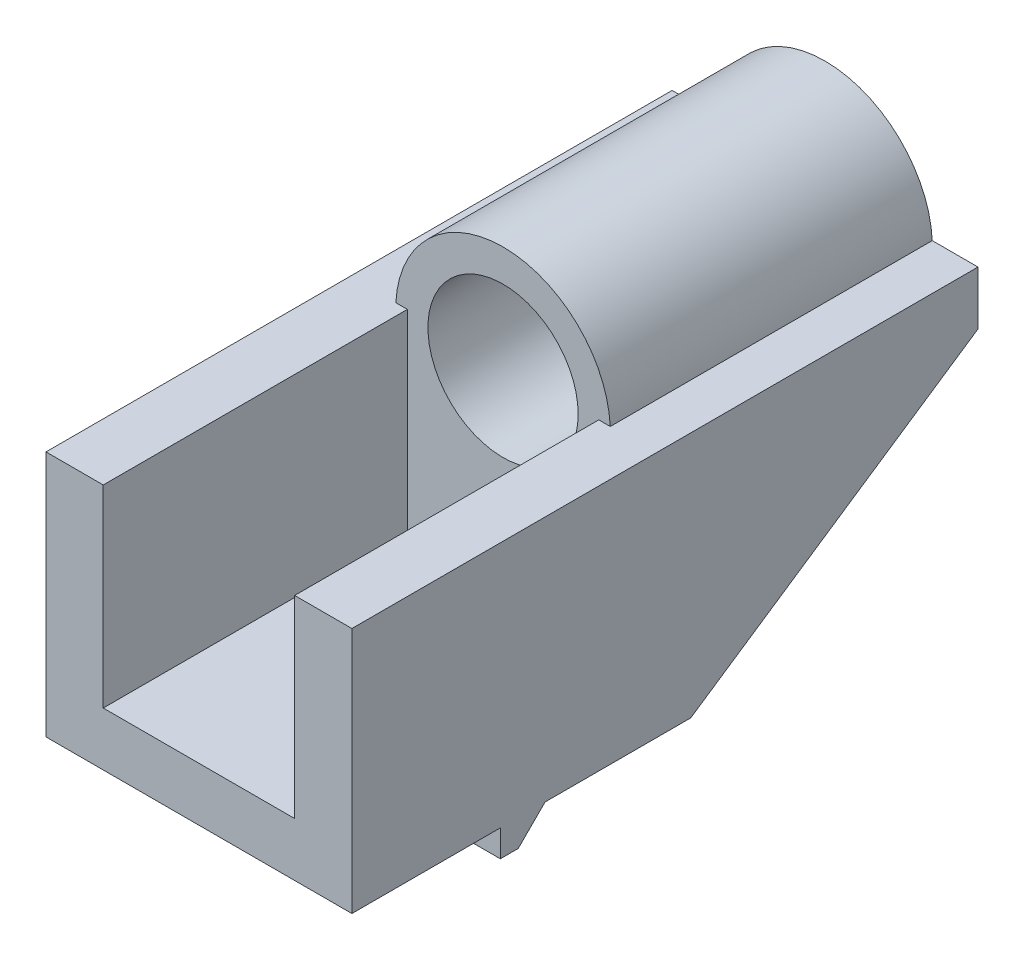
ISO-10303-21;
HEADER;
FILE_DESCRIPTION(('STEP AP214'),'2;1');
FILE_NAME('part.step','',(''),(''),'','','');
FILE_SCHEMA(('AUTOMOTIVE_DESIGN { 1 0 10303 214 1 1 1 1 }'));
ENDSEC;
DATA;
#1=APPLICATION_CONTEXT('core data for automotive mechanical design processes');
#2=APPLICATION_PROTOCOL_DEFINITION('international standard','automotive_design',2000,#1);
#3=PRODUCT_CONTEXT('',#1,'mechanical');
#4=PRODUCT('Part','Part','',(#3));
#5=PRODUCT_RELATED_PRODUCT_CATEGORY('part','',(#4));
#6=PRODUCT_DEFINITION_FORMATION('','',#4);
#7=PRODUCT_DEFINITION_CONTEXT('part definition',#1,'design');
#8=PRODUCT_DEFINITION('design','',#6,#7);
#9=PRODUCT_DEFINITION_SHAPE('','',#8);
#10=(LENGTH_UNIT() NAMED_UNIT(*) SI_UNIT(.MILLI.,.METRE.));
#11=(NAMED_UNIT(*) PLANE_ANGLE_UNIT() SI_UNIT($,.RADIAN.));
#12=(NAMED_UNIT(*) SI_UNIT($,.STERADIAN.) SOLID_ANGLE_UNIT());
#13=UNCERTAINTY_MEASURE_WITH_UNIT(LENGTH_MEASURE(1.E-05),#10,'distance_accuracy_value','');
#14=(GEOMETRIC_REPRESENTATION_CONTEXT(3) GLOBAL_UNCERTAINTY_ASSIGNED_CONTEXT((#13)) GLOBAL_UNIT_ASSIGNED_CONTEXT((#10,
#11,#12)) REPRESENTATION_CONTEXT('',''));
#15=CARTESIAN_POINT('',(0.,0.,0.));
#16=DIRECTION('',(0.,0.,1.));
#17=DIRECTION('',(1.,0.,0.));
#18=AXIS2_PLACEMENT_3D('',#15,#16,#17);
#19=CARTESIAN_POINT('',(0.,-0.301749999999999,0.));
#20=DIRECTION('',(0.,0.,1.));
#21=DIRECTION('',(1.,0.,0.));
#22=AXIS2_PLACEMENT_3D('',#19,#20,#21);
#23=CYLINDRICAL_SURFACE('',#22,6.);
#24=CARTESIAN_POINT('',(0.,-0.301750000000001,16.8));
#25=DIRECTION('',(0.,0.,1.));
#26=DIRECTION('',(0.,1.,0.));
#27=AXIS2_PLACEMENT_3D('',#24,#25,#26);
#28=CIRCLE('',#27,6.);
#29=CARTESIAN_POINT('',(1.553,-6.09728198593538,16.8));
#30=VERTEX_POINT('',#29);
#31=CARTESIAN_POINT('',(5.35905280226833,-3.,16.8));
#32=VERTEX_POINT('',#31);
#33=EDGE_CURVE('E741',#30,#32,#28,.T.);
#34=ORIENTED_EDGE('',*,*,#33,.F.);
#35=DIRECTION('',(0.,0.,1.));
#36=VECTOR('',#35,1.);
#37=CARTESIAN_POINT('',(1.553,-6.09728198593537,0.));
#38=LINE('',#37,#36);
#39=CARTESIAN_POINT('',(1.553,-6.09728198593538,8.5353865261744));
#40=VERTEX_POINT('',#39);
#41=EDGE_CURVE('E56',#30,#40,#38,.F.);
#42=ORIENTED_EDGE('',*,*,#41,.T.);
#43=CARTESIAN_POINT('',(0.,-0.301749999999999,5.17620731889345));
#44=DIRECTION('',(0.,0.50146903897387,0.865175590819935));
#45=DIRECTION('',(0.,-0.865175590819935,0.50146903897387));
#46=AXIS2_PLACEMENT_3D('',#43,#44,#45);
#47=ELLIPSE('',#46,6.93500841177656,6.);
#48=CARTESIAN_POINT('',(-1.553,-6.09728198593537,8.5353865261744));
#49=VERTEX_POINT('',#48);
#50=EDGE_CURVE('E733',#40,#49,#47,.F.);
#51=ORIENTED_EDGE('',*,*,#50,.T.);
#52=DIRECTION('',(0.,0.,1.));
#53=VECTOR('',#52,1.);
#54=CARTESIAN_POINT('',(-1.553,-6.09728198593537,0.));
#55=LINE('',#54,#53);
#56=CARTESIAN_POINT('',(-1.553,-6.09728198593537,16.8));
#57=VERTEX_POINT('',#56);
#58=EDGE_CURVE('E727',#57,#49,#55,.F.);
#59=ORIENTED_EDGE('',*,*,#58,.F.);
#60=CARTESIAN_POINT('',(-5.35905280226833,-3.,16.8));
#61=VERTEX_POINT('',#60);
#62=EDGE_CURVE('E742',#61,#57,#28,.T.);
#63=ORIENTED_EDGE('',*,*,#62,.F.);
#64=DIRECTION('',(0.,0.,-1.));
#65=VECTOR('',#64,1.);
#66=CARTESIAN_POINT('',(-5.35905280226833,-3.,16.8));
#67=LINE('',#66,#65);
#68=CARTESIAN_POINT('',(-5.35905280226833,-3.,0.));
#69=VERTEX_POINT('',#68);
#70=EDGE_CURVE('E517',#61,#69,#67,.T.);
#71=ORIENTED_EDGE('',*,*,#70,.T.);
#72=CARTESIAN_POINT('',(0.,-0.301749999999999,0.));
#73=DIRECTION('',(0.,0.,1.));
#74=DIRECTION('',(1.,0.,0.));
#75=AXIS2_PLACEMENT_3D('',#72,#73,#74);
#76=CIRCLE('',#75,6.);
#77=CARTESIAN_POINT('',(5.35905280226833,-3.,0.));
#78=VERTEX_POINT('',#77);
#79=EDGE_CURVE('E479',#69,#78,#76,.T.);
#80=ORIENTED_EDGE('',*,*,#79,.T.);
#81=DIRECTION('',(0.,0.,-1.));
#82=VECTOR('',#81,1.);
#83=CARTESIAN_POINT('',(5.35905280226833,-3.,16.8));
#84=LINE('',#83,#82);
#85=EDGE_CURVE('E514',#32,#78,#84,.T.);
#86=ORIENTED_EDGE('',*,*,#85,.F.);
#87=EDGE_LOOP('',(#34,#42,#51,#59,#63,#71,#80,#86));
#88=FACE_BOUND('',#87,.T.);
#89=ADVANCED_FACE('F33',(#88),#23,.T.);
#90=CARTESIAN_POINT('',(0.,-0.301750000000001,16.8));
#91=DIRECTION('',(0.,0.,-1.));
#92=DIRECTION('',(0.,1.,0.));
#93=AXIS2_PLACEMENT_3D('',#90,#91,#92);
#94=PLANE('',#93);
#95=DIRECTION('',(0.659479829449439,-0.751722258915711,0.));
#96=VECTOR('',#95,1.);
#97=CARTESIAN_POINT('',(1.553,-6.09728198593538,16.8));
#98=LINE('',#97,#96);
#99=CARTESIAN_POINT('',(5.353,-10.4287936657762,16.8));
#100=VERTEX_POINT('',#99);
#101=EDGE_CURVE('E729',#30,#100,#98,.T.);
#102=ORIENTED_EDGE('',*,*,#101,.F.);
#103=ORIENTED_EDGE('',*,*,#33,.T.);
#104=DIRECTION('',(-0.000814775659621067,-0.999999668070257,0.));
#105=VECTOR('',#104,1.);
#106=CARTESIAN_POINT('',(5.35905280226833,-3.,16.8));
#107=LINE('',#106,#105);
#108=EDGE_CURVE('E745',#32,#100,#107,.T.);
#109=ORIENTED_EDGE('',*,*,#108,.T.);
#110=EDGE_LOOP('',(#102,#103,#109));
#111=FACE_BOUND('',#110,.T.);
#112=ADVANCED_FACE('F580',(#111),#94,.T.);
#113=CARTESIAN_POINT('',(8.55,-3.,0.));
#114=DIRECTION('',(0.,0.829796898853625,0.558065503908732));
#115=DIRECTION('',(0.,-0.558065503908732,0.829796898853625));
#116=AXIS2_PLACEMENT_3D('',#113,#114,#115);
#117=PLANE('',#116);
#118=DIRECTION('',(0.,0.558065503908732,-0.829796898853625));
#119=VECTOR('',#118,1.);
#120=CARTESIAN_POINT('',(8.55,-3.,0.));
#121=LINE('',#120,#119);
#122=CARTESIAN_POINT('',(8.55,-13.8,16.0587));
#123=VERTEX_POINT('',#122);
#124=CARTESIAN_POINT('',(8.55,-3.,0.));
#125=VERTEX_POINT('',#124);
#126=EDGE_CURVE('E426',#123,#125,#121,.T.);
#127=ORIENTED_EDGE('',*,*,#126,.F.);
#128=DIRECTION('',(1.,0.,0.));
#129=VECTOR('',#128,1.);
#130=CARTESIAN_POINT('',(-8.55105,-13.8,16.0587));
#131=LINE('',#130,#129);
#132=CARTESIAN_POINT('',(5.353,-13.8,16.0587));
#133=VERTEX_POINT('',#132);
#134=EDGE_CURVE('E48',#133,#123,#131,.T.);
#135=ORIENTED_EDGE('',*,*,#134,.F.);
#136=DIRECTION('',(0.,0.558065503908732,-0.829796898853625));
#137=VECTOR('',#136,1.);
#138=CARTESIAN_POINT('',(5.353,-10.4287936657762,11.0459971148705));
#139=LINE('',#138,#137);
#140=CARTESIAN_POINT('',(5.353,-10.4287936657762,11.0459971148705));
#141=VERTEX_POINT('',#140);
#142=EDGE_CURVE('E508',#133,#141,#139,.T.);
#143=ORIENTED_EDGE('',*,*,#142,.T.);
#144=DIRECTION('',(0.000454698292982337,0.558065446218557,-0.829796813073143));
#145=VECTOR('',#144,1.);
#146=CARTESIAN_POINT('',(5.35905346199838,-2.99919029266284,-0.00120396733473974));
#147=LINE('',#146,#145);
#148=EDGE_CURVE('E274',#141,#78,#147,.T.);
#149=ORIENTED_EDGE('',*,*,#148,.T.);
#150=DIRECTION('',(-1.,0.,0.));
#151=VECTOR('',#150,1.);
#152=CARTESIAN_POINT('',(8.55,-3.,0.));
#153=LINE('',#152,#151);
#154=EDGE_CURVE('E461',#125,#78,#153,.T.);
#155=ORIENTED_EDGE('',*,*,#154,.F.);
#156=EDGE_LOOP('',(#127,#135,#143,#149,#155));
#157=FACE_BOUND('',#156,.T.);
#158=ADVANCED_FACE('F506',(#157),#117,.F.);
#159=CARTESIAN_POINT('',(-8.55,-15.3,25.702));
#160=DIRECTION('',(0.,-0.707106781186547,-0.707106781186548));
#161=DIRECTION('',(0.,0.707106781186548,-0.707106781186547));
#162=AXIS2_PLACEMENT_3D('',#159,#160,#161);
#163=PLANE('',#162);
#164=DIRECTION('',(0.,0.707106781186548,-0.707106781186547));
#165=VECTOR('',#164,1.);
#166=CARTESIAN_POINT('',(4.053,-1.6985,12.1005));
#167=LINE('',#166,#165);
#168=CARTESIAN_POINT('',(4.053,-15.3,25.702));
#169=VERTEX_POINT('',#168);
#170=CARTESIAN_POINT('',(4.053,-13.8,24.202));
#171=VERTEX_POINT('',#170);
#172=EDGE_CURVE('E311',#169,#171,#167,.T.);
#173=ORIENTED_EDGE('',*,*,#172,.T.);
#174=DIRECTION('',(1.,0.,0.));
#175=VECTOR('',#174,1.);
#176=CARTESIAN_POINT('',(-8.55,-13.8,24.202));
#177=LINE('',#176,#175);
#178=CARTESIAN_POINT('',(8.55,-13.8,24.202));
#179=VERTEX_POINT('',#178);
#180=EDGE_CURVE('E365',#171,#179,#177,.T.);
#181=ORIENTED_EDGE('',*,*,#180,.T.);
#182=DIRECTION('',(0.,0.707106781186548,-0.707106781186547));
#183=VECTOR('',#182,1.);
#184=CARTESIAN_POINT('',(8.55,-15.3,25.702));
#185=LINE('',#184,#183);
#186=CARTESIAN_POINT('',(8.55,-15.3,25.702));
#187=VERTEX_POINT('',#186);
#188=EDGE_CURVE('E354',#187,#179,#185,.T.);
#189=ORIENTED_EDGE('',*,*,#188,.F.);
#190=DIRECTION('',(1.,0.,0.));
#191=VECTOR('',#190,1.);
#192=CARTESIAN_POINT('',(-8.55,-15.3,25.702));
#193=LINE('',#192,#191);
#194=EDGE_CURVE('E371',#169,#187,#193,.T.);
#195=ORIENTED_EDGE('',*,*,#194,.F.);
#196=EDGE_LOOP('',(#173,#181,#189,#195));
#197=FACE_BOUND('',#196,.T.);
#198=ADVANCED_FACE('F631',(#197),#163,.T.);
#199=CARTESIAN_POINT('',(-8.55,-15.3,26.702));
#200=DIRECTION('',(0.,-1.,0.));
#201=DIRECTION('',(0.,0.,-1.));
#202=AXIS2_PLACEMENT_3D('',#199,#200,#201);
#203=PLANE('',#202);
#204=DIRECTION('',(0.,0.,1.));
#205=VECTOR('',#204,1.);
#206=CARTESIAN_POINT('',(4.053,-15.3,-0.001000000000001));
#207=LINE('',#206,#205);
#208=CARTESIAN_POINT('',(4.053,-15.3,26.702));
#209=VERTEX_POINT('',#208);
#210=EDGE_CURVE('E323',#169,#209,#207,.T.);
#211=ORIENTED_EDGE('',*,*,#210,.F.);
#212=ORIENTED_EDGE('',*,*,#194,.T.);
#213=DIRECTION('',(0.,0.,-1.));
#214=VECTOR('',#213,1.);
#215=CARTESIAN_POINT('',(8.55,-15.3,26.702));
#216=LINE('',#215,#214);
#217=CARTESIAN_POINT('',(8.55,-15.3,26.702));
#218=VERTEX_POINT('',#217);
#219=EDGE_CURVE('E351',#218,#187,#216,.T.);
#220=ORIENTED_EDGE('',*,*,#219,.F.);
#221=DIRECTION('',(1.,0.,0.));
#222=VECTOR('',#221,1.);
#223=CARTESIAN_POINT('',(-8.55,-15.3,26.702));
#224=LINE('',#223,#222);
#225=EDGE_CURVE('E379',#209,#218,#224,.T.);
#226=ORIENTED_EDGE('',*,*,#225,.F.);
#227=EDGE_LOOP('',(#211,#212,#220,#226));
#228=FACE_BOUND('',#227,.T.);
#229=ADVANCED_FACE('F625',(#228),#203,.T.);
#230=CARTESIAN_POINT('',(-8.55,-13.8,26.702));
#231=DIRECTION('',(0.,0.,1.));
#232=DIRECTION('',(1.,0.,0.));
#233=AXIS2_PLACEMENT_3D('',#230,#231,#232);
#234=PLANE('',#233);
#235=DIRECTION('',(0.,1.,0.));
#236=VECTOR('',#235,1.);
#237=CARTESIAN_POINT('',(4.053,-13.8,26.702));
#238=LINE('',#237,#236);
#239=CARTESIAN_POINT('',(4.053,-13.8,26.702));
#240=VERTEX_POINT('',#239);
#241=EDGE_CURVE('E320',#209,#240,#238,.T.);
#242=ORIENTED_EDGE('',*,*,#241,.F.);
#243=ORIENTED_EDGE('',*,*,#225,.T.);
#244=DIRECTION('',(0.,-1.,0.));
#245=VECTOR('',#244,1.);
#246=CARTESIAN_POINT('',(8.55,-13.8,26.702));
#247=LINE('',#246,#245);
#248=CARTESIAN_POINT('',(8.55,-13.8,26.702));
#249=VERTEX_POINT('',#248);
#250=EDGE_CURVE('E337',#249,#218,#247,.T.);
#251=ORIENTED_EDGE('',*,*,#250,.F.);
#252=DIRECTION('',(1.,0.,0.));
#253=VECTOR('',#252,1.);
#254=CARTESIAN_POINT('',(-8.55,-13.8,26.702));
#255=LINE('',#254,#253);
#256=EDGE_CURVE('E368',#240,#249,#255,.T.);
#257=ORIENTED_EDGE('',*,*,#256,.F.);
#258=EDGE_LOOP('',(#242,#243,#251,#257));
#259=FACE_BOUND('',#258,.T.);
#260=ADVANCED_FACE('F420',(#259),#234,.T.);
#261=CARTESIAN_POINT('',(8.55,0.,35.));
#262=DIRECTION('',(0.,-1.,0.));
#263=DIRECTION('',(0.,0.,-1.));
#264=AXIS2_PLACEMENT_3D('',#261,#262,#263);
#265=PLANE('',#264);
#266=DIRECTION('',(-1.,0.,0.));
#267=VECTOR('',#266,1.);
#268=CARTESIAN_POINT('',(8.55,0.,0.));
#269=LINE('',#268,#267);
#270=CARTESIAN_POINT('',(8.55,0.,0.));
#271=VERTEX_POINT('',#270);
#272=CARTESIAN_POINT('',(5.99240744087883,0.,0.));
#273=VERTEX_POINT('',#272);
#274=EDGE_CURVE('E465',#271,#273,#269,.T.);
#275=ORIENTED_EDGE('',*,*,#274,.T.);
#276=DIRECTION('',(0.,0.,1.));
#277=VECTOR('',#276,1.);
#278=CARTESIAN_POINT('',(5.99240744087883,0.,0.));
#279=LINE('',#278,#277);
#280=CARTESIAN_POINT('',(5.99240744087883,0.,18.));
#281=VERTEX_POINT('',#280);
#282=EDGE_CURVE('E501',#273,#281,#279,.T.);
#283=ORIENTED_EDGE('',*,*,#282,.T.);
#284=DIRECTION('',(-1.,0.,0.));
#285=VECTOR('',#284,1.);
#286=CARTESIAN_POINT('',(8.55,0.,18.));
#287=LINE('',#286,#285);
#288=CARTESIAN_POINT('',(5.35,0.,18.));
#289=VERTEX_POINT('',#288);
#290=EDGE_CURVE('E525',#281,#289,#287,.T.);
#291=ORIENTED_EDGE('',*,*,#290,.T.);
#292=DIRECTION('',(0.,0.,1.));
#293=VECTOR('',#292,1.);
#294=CARTESIAN_POINT('',(5.35,0.,18.));
#295=LINE('',#294,#293);
#296=CARTESIAN_POINT('',(5.35,0.,35.));
#297=VERTEX_POINT('',#296);
#298=EDGE_CURVE('E543',#289,#297,#295,.T.);
#299=ORIENTED_EDGE('',*,*,#298,.T.);
#300=DIRECTION('',(-1.,0.,0.));
#301=VECTOR('',#300,1.);
#302=CARTESIAN_POINT('',(8.55,0.,35.));
#303=LINE('',#302,#301);
#304=CARTESIAN_POINT('',(8.55,0.,35.));
#305=VERTEX_POINT('',#304);
#306=EDGE_CURVE('E41',#305,#297,#303,.T.);
#307=ORIENTED_EDGE('',*,*,#306,.F.);
#308=DIRECTION('',(0.,0.,1.));
#309=VECTOR('',#308,1.);
#310=CARTESIAN_POINT('',(8.55,0.,35.));
#311=LINE('',#310,#309);
#312=EDGE_CURVE('E469',#271,#305,#311,.T.);
#313=ORIENTED_EDGE('',*,*,#312,.F.);
#314=EDGE_LOOP('',(#275,#283,#291,#299,#307,#313));
#315=FACE_BOUND('',#314,.T.);
#316=ADVANCED_FACE('F499',(#315),#265,.F.);
#317=CARTESIAN_POINT('',(-5.35,0.,18.));
#318=VERTEX_POINT('',#317);
#319=CARTESIAN_POINT('',(-5.99240744087883,0.,18.));
#320=VERTEX_POINT('',#319);
#321=EDGE_CURVE('E524',#318,#320,#287,.T.);
#322=ORIENTED_EDGE('',*,*,#321,.T.);
#323=DIRECTION('',(0.,0.,1.));
#324=VECTOR('',#323,1.);
#325=CARTESIAN_POINT('',(-5.99240744087883,0.,0.));
#326=LINE('',#325,#324);
#327=CARTESIAN_POINT('',(-5.99240744087883,0.,0.));
#328=VERTEX_POINT('',#327);
#329=EDGE_CURVE('E489',#320,#328,#326,.F.);
#330=ORIENTED_EDGE('',*,*,#329,.T.);
#331=CARTESIAN_POINT('',(-8.55,0.,0.));
#332=VERTEX_POINT('',#331);
#333=EDGE_CURVE('E442',#328,#332,#269,.T.);
#334=ORIENTED_EDGE('',*,*,#333,.T.);
#335=DIRECTION('',(0.,0.,1.));
#336=VECTOR('',#335,1.);
#337=CARTESIAN_POINT('',(-8.55,0.,35.));
#338=LINE('',#337,#336);
#339=CARTESIAN_POINT('',(-8.55,0.,35.));
#340=VERTEX_POINT('',#339);
#341=EDGE_CURVE('E443',#332,#340,#338,.T.);
#342=ORIENTED_EDGE('',*,*,#341,.T.);
#343=CARTESIAN_POINT('',(-5.35,0.,35.));
#344=VERTEX_POINT('',#343);
#345=EDGE_CURVE('E458',#344,#340,#303,.T.);
#346=ORIENTED_EDGE('',*,*,#345,.F.);
#347=DIRECTION('',(0.,0.,1.));
#348=VECTOR('',#347,1.);
#349=CARTESIAN_POINT('',(-5.35,0.,18.));
#350=LINE('',#349,#348);
#351=EDGE_CURVE('E447',#318,#344,#350,.T.);
#352=ORIENTED_EDGE('',*,*,#351,.F.);
#353=EDGE_LOOP('',(#322,#330,#334,#342,#346,#352));
#354=FACE_BOUND('',#353,.T.);
#355=ADVANCED_FACE('F35',(#354),#265,.F.);
#356=CARTESIAN_POINT('',(8.55,-13.8,35.));
#357=DIRECTION('',(0.,0.,-1.));
#358=DIRECTION('',(-1.,0.,0.));
#359=AXIS2_PLACEMENT_3D('',#356,#357,#358);
#360=PLANE('',#359);
#361=DIRECTION('',(1.,0.,0.));
#362=VECTOR('',#361,1.);
#363=CARTESIAN_POINT('',(-5.35,-10.8,35.));
#364=LINE('',#363,#362);
#365=CARTESIAN_POINT('',(-5.35,-10.8,35.));
#366=VERTEX_POINT('',#365);
#367=CARTESIAN_POINT('',(5.35,-10.8,35.));
#368=VERTEX_POINT('',#367);
#369=EDGE_CURVE('E538',#366,#368,#364,.T.);
#370=ORIENTED_EDGE('',*,*,#369,.F.);
#371=DIRECTION('',(0.,-1.,0.));
#372=VECTOR('',#371,1.);
#373=CARTESIAN_POINT('',(-5.35,0.,35.));
#374=LINE('',#373,#372);
#375=EDGE_CURVE('E527',#344,#366,#374,.T.);
#376=ORIENTED_EDGE('',*,*,#375,.F.);
#377=ORIENTED_EDGE('',*,*,#345,.T.);
#378=DIRECTION('',(0.,-1.,0.));
#379=VECTOR('',#378,1.);
#380=CARTESIAN_POINT('',(-8.55,-13.8,35.));
#381=LINE('',#380,#379);
#382=CARTESIAN_POINT('',(-8.55,-13.8,35.));
#383=VERTEX_POINT('',#382);
#384=EDGE_CURVE('E446',#340,#383,#381,.T.);
#385=ORIENTED_EDGE('',*,*,#384,.T.);
#386=DIRECTION('',(-1.,0.,0.));
#387=VECTOR('',#386,1.);
#388=CARTESIAN_POINT('',(8.55,-13.8,35.));
#389=LINE('',#388,#387);
#390=CARTESIAN_POINT('',(8.55,-13.8,35.));
#391=VERTEX_POINT('',#390);
#392=EDGE_CURVE('E459',#391,#383,#389,.T.);
#393=ORIENTED_EDGE('',*,*,#392,.F.);
#394=DIRECTION('',(0.,-1.,0.));
#395=VECTOR('',#394,1.);
#396=CARTESIAN_POINT('',(8.55,-13.8,35.));
#397=LINE('',#396,#395);
#398=EDGE_CURVE('E424',#305,#391,#397,.T.);
#399=ORIENTED_EDGE('',*,*,#398,.F.);
#400=ORIENTED_EDGE('',*,*,#306,.T.);
#401=DIRECTION('',(0.,1.,0.));
#402=VECTOR('',#401,1.);
#403=CARTESIAN_POINT('',(5.35,0.,35.));
#404=LINE('',#403,#402);
#405=EDGE_CURVE('E531',#368,#297,#404,.T.);
#406=ORIENTED_EDGE('',*,*,#405,.F.);
#407=EDGE_LOOP('',(#370,#376,#377,#385,#393,#399,#400,#406));
#408=FACE_BOUND('',#407,.T.);
#409=ADVANCED_FACE('F558',(#408),#360,.F.);
#410=CARTESIAN_POINT('',(8.55,-13.8,16.0587));
#411=DIRECTION('',(0.,1.,0.));
#412=DIRECTION('',(0.,0.,1.));
#413=AXIS2_PLACEMENT_3D('',#410,#411,#412);
#414=PLANE('',#413);
#415=DIRECTION('',(0.,0.,-1.));
#416=VECTOR('',#415,1.);
#417=CARTESIAN_POINT('',(-8.55,-13.8,16.0587));
#418=LINE('',#417,#416);
#419=CARTESIAN_POINT('',(-8.55,-13.8,24.202));
#420=VERTEX_POINT('',#419);
#421=CARTESIAN_POINT('',(-8.55,-13.8,16.0587));
#422=VERTEX_POINT('',#421);
#423=EDGE_CURVE('E263',#420,#422,#418,.T.);
#424=ORIENTED_EDGE('',*,*,#423,.T.);
#425=DIRECTION('',(-1.,0.,0.));
#426=VECTOR('',#425,1.);
#427=CARTESIAN_POINT('',(8.55105,-13.8,16.0587));
#428=LINE('',#427,#426);
#429=CARTESIAN_POINT('',(-5.353,-13.8,16.0587));
#430=VERTEX_POINT('',#429);
#431=EDGE_CURVE('E247',#430,#422,#428,.T.);
#432=ORIENTED_EDGE('',*,*,#431,.F.);
#433=DIRECTION('',(0.,0.,-1.));
#434=VECTOR('',#433,1.);
#435=CARTESIAN_POINT('',(-5.353,-13.8,16.8));
#436=LINE('',#435,#434);
#437=CARTESIAN_POINT('',(-5.353,-13.8,16.8));
#438=VERTEX_POINT('',#437);
#439=EDGE_CURVE('E260',#438,#430,#436,.T.);
#440=ORIENTED_EDGE('',*,*,#439,.F.);
#441=DIRECTION('',(-0.707106781186547,0.,0.707106781186548));
#442=VECTOR('',#441,1.);
#443=CARTESIAN_POINT('',(-1.553,-13.8,13.));
#444=LINE('',#443,#442);
#445=CARTESIAN_POINT('',(-1.553,-13.8,13.));
#446=VERTEX_POINT('',#445);
#447=EDGE_CURVE('E270',#446,#438,#444,.T.);
#448=ORIENTED_EDGE('',*,*,#447,.F.);
#449=DIRECTION('',(0.,0.,1.));
#450=VECTOR('',#449,1.);
#451=CARTESIAN_POINT('',(-1.553,-13.8,0.));
#452=LINE('',#451,#450);
#453=CARTESIAN_POINT('',(-1.553,-13.8,15.002));
#454=VERTEX_POINT('',#453);
#455=EDGE_CURVE('E302',#446,#454,#452,.T.);
#456=ORIENTED_EDGE('',*,*,#455,.T.);
#457=DIRECTION('',(1.,0.,0.));
#458=VECTOR('',#457,1.);
#459=CARTESIAN_POINT('',(-8.55,-13.8,15.002));
#460=LINE('',#459,#458);
#461=CARTESIAN_POINT('',(1.553,-13.8,15.002));
#462=VERTEX_POINT('',#461);
#463=EDGE_CURVE('E333',#454,#462,#460,.T.);
#464=ORIENTED_EDGE('',*,*,#463,.T.);
#465=DIRECTION('',(0.,0.,1.));
#466=VECTOR('',#465,1.);
#467=CARTESIAN_POINT('',(1.553,-13.8,0.));
#468=LINE('',#467,#466);
#469=CARTESIAN_POINT('',(1.553,-13.8,13.));
#470=VERTEX_POINT('',#469);
#471=EDGE_CURVE('E290',#470,#462,#468,.T.);
#472=ORIENTED_EDGE('',*,*,#471,.F.);
#473=DIRECTION('',(-0.707106781186548,0.,-0.707106781186547));
#474=VECTOR('',#473,1.);
#475=CARTESIAN_POINT('',(5.353,-13.8,16.8));
#476=LINE('',#475,#474);
#477=CARTESIAN_POINT('',(5.353,-13.8,16.8));
#478=VERTEX_POINT('',#477);
#479=EDGE_CURVE('E272',#478,#470,#476,.T.);
#480=ORIENTED_EDGE('',*,*,#479,.F.);
#481=DIRECTION('',(0.,0.,1.));
#482=VECTOR('',#481,1.);
#483=CARTESIAN_POINT('',(5.353,-13.8,0.));
#484=LINE('',#483,#482);
#485=EDGE_CURVE('E269',#133,#478,#484,.T.);
#486=ORIENTED_EDGE('',*,*,#485,.F.);
#487=ORIENTED_EDGE('',*,*,#134,.T.);
#488=DIRECTION('',(0.,0.,-1.));
#489=VECTOR('',#488,1.);
#490=CARTESIAN_POINT('',(8.55,-13.8,16.0587));
#491=LINE('',#490,#489);
#492=EDGE_CURVE('E427',#179,#123,#491,.T.);
#493=ORIENTED_EDGE('',*,*,#492,.F.);
#494=ORIENTED_EDGE('',*,*,#180,.F.);
#495=DIRECTION('',(0.,0.,1.));
#496=VECTOR('',#495,1.);
#497=CARTESIAN_POINT('',(4.053,-13.8,-0.001000000000001));
#498=LINE('',#497,#496);
#499=EDGE_CURVE('E324',#171,#240,#498,.T.);
#500=ORIENTED_EDGE('',*,*,#499,.T.);
#501=ORIENTED_EDGE('',*,*,#256,.T.);
#502=EDGE_CURVE('E415',#391,#249,#491,.T.);
#503=ORIENTED_EDGE('',*,*,#502,.F.);
#504=ORIENTED_EDGE('',*,*,#392,.T.);
#505=CARTESIAN_POINT('',(-8.55,-13.8,26.702));
#506=VERTEX_POINT('',#505);
#507=EDGE_CURVE('E453',#383,#506,#418,.T.);
#508=ORIENTED_EDGE('',*,*,#507,.T.);
#509=CARTESIAN_POINT('',(-4.053,-13.8,26.702));
#510=VERTEX_POINT('',#509);
#511=EDGE_CURVE('E383',#506,#510,#255,.T.);
#512=ORIENTED_EDGE('',*,*,#511,.T.);
#513=DIRECTION('',(0.,0.,1.));
#514=VECTOR('',#513,1.);
#515=CARTESIAN_POINT('',(-4.053,-13.8,-0.001000000000001));
#516=LINE('',#515,#514);
#517=CARTESIAN_POINT('',(-4.053,-13.8,24.202));
#518=VERTEX_POINT('',#517);
#519=EDGE_CURVE('E313',#518,#510,#516,.T.);
#520=ORIENTED_EDGE('',*,*,#519,.F.);
#521=EDGE_CURVE('E361',#420,#518,#177,.T.);
#522=ORIENTED_EDGE('',*,*,#521,.F.);
#523=EDGE_LOOP('',(#424,#432,#440,#448,#456,#464,#472,#480,#486,#487,#493,#494,#500,#501,#503,
#504,#508,#512,#520,#522));
#524=FACE_BOUND('',#523,.T.);
#525=CARTESIAN_POINT('',(0.,-13.8,25.));
#526=DIRECTION('',(0.,1.,0.));
#527=DIRECTION('',(0.,0.,1.));
#528=AXIS2_PLACEMENT_3D('',#525,#526,#527);
#529=CIRCLE('',#528,2.2);
#530=CARTESIAN_POINT('',(0.,-13.8,27.2));
#531=VERTEX_POINT('',#530);
#532=EDGE_CURVE('E330',#531,#531,#529,.T.);
#533=ORIENTED_EDGE('',*,*,#532,.T.);
#534=EDGE_LOOP('',(#533));
#535=FACE_BOUND('',#534,.T.);
#536=ADVANCED_FACE('F257',(#524,#535),#414,.F.);
#537=CARTESIAN_POINT('',(-8.55,-3.,0.));
#538=VERTEX_POINT('',#537);
#539=EDGE_CURVE('E464',#69,#538,#153,.T.);
#540=ORIENTED_EDGE('',*,*,#539,.F.);
#541=DIRECTION('',(0.000454698292982337,-0.558065446218557,0.829796813073143));
#542=VECTOR('',#541,1.);
#543=CARTESIAN_POINT('',(-5.35904992656418,-3.00352944170148,0.00524798568995413));
#544=LINE('',#543,#542);
#545=CARTESIAN_POINT('',(-5.353,-10.4287936657762,11.0459971148705));
#546=VERTEX_POINT('',#545);
#547=EDGE_CURVE('E249',#69,#546,#544,.T.);
#548=ORIENTED_EDGE('',*,*,#547,.T.);
#549=DIRECTION('',(0.,-0.558065503908732,0.829796898853625));
#550=VECTOR('',#549,1.);
#551=CARTESIAN_POINT('',(-5.353,-10.4287936657762,11.0459971148705));
#552=LINE('',#551,#550);
#553=EDGE_CURVE('E243',#546,#430,#552,.T.);
#554=ORIENTED_EDGE('',*,*,#553,.T.);
#555=ORIENTED_EDGE('',*,*,#431,.T.);
#556=DIRECTION('',(0.,0.558065503908732,-0.829796898853625));
#557=VECTOR('',#556,1.);
#558=CARTESIAN_POINT('',(-8.55,-3.,0.));
#559=LINE('',#558,#557);
#560=EDGE_CURVE('E450',#422,#538,#559,.T.);
#561=ORIENTED_EDGE('',*,*,#560,.T.);
#562=EDGE_LOOP('',(#540,#548,#554,#555,#561));
#563=FACE_BOUND('',#562,.T.);
#564=ADVANCED_FACE('F246',(#563),#117,.F.);
#565=CARTESIAN_POINT('',(8.55,0.,0.));
#566=DIRECTION('',(0.,0.,1.));
#567=DIRECTION('',(0.,-1.,0.));
#568=AXIS2_PLACEMENT_3D('',#565,#566,#567);
#569=PLANE('',#568);
#570=CARTESIAN_POINT('',(0.,-0.301749999999999,0.));
#571=DIRECTION('',(0.,0.,1.));
#572=DIRECTION('',(1.,0.,0.));
#573=AXIS2_PLACEMENT_3D('',#570,#571,#572);
#574=CIRCLE('',#573,4.2);
#575=CARTESIAN_POINT('',(4.2,-0.301749999999999,0.));
#576=VERTEX_POINT('',#575);
#577=EDGE_CURVE('E386',#576,#576,#574,.T.);
#578=ORIENTED_EDGE('',*,*,#577,.T.);
#579=EDGE_LOOP('',(#578));
#580=FACE_BOUND('',#579,.T.);
#581=ORIENTED_EDGE('',*,*,#333,.F.);
#582=EDGE_CURVE('E492',#273,#328,#76,.T.);
#583=ORIENTED_EDGE('',*,*,#582,.F.);
#584=ORIENTED_EDGE('',*,*,#274,.F.);
#585=DIRECTION('',(0.,1.,0.));
#586=VECTOR('',#585,1.);
#587=CARTESIAN_POINT('',(8.55,0.,0.));
#588=LINE('',#587,#586);
#589=EDGE_CURVE('E429',#125,#271,#588,.T.);
#590=ORIENTED_EDGE('',*,*,#589,.F.);
#591=ORIENTED_EDGE('',*,*,#154,.T.);
#592=ORIENTED_EDGE('',*,*,#79,.F.);
#593=ORIENTED_EDGE('',*,*,#539,.T.);
#594=DIRECTION('',(0.,1.,0.));
#595=VECTOR('',#594,1.);
#596=CARTESIAN_POINT('',(-8.55,0.,0.));
#597=LINE('',#596,#595);
#598=EDGE_CURVE('E467',#538,#332,#597,.T.);
#599=ORIENTED_EDGE('',*,*,#598,.T.);
#600=EDGE_LOOP('',(#581,#583,#584,#590,#591,#592,#593,#599));
#601=FACE_BOUND('',#600,.T.);
#602=ADVANCED_FACE('F477',(#580,#601),#569,.F.);
#603=CARTESIAN_POINT('',(8.55,0.,0.));
#604=DIRECTION('',(-1.,0.,0.));
#605=DIRECTION('',(0.,0.,1.));
#606=AXIS2_PLACEMENT_3D('',#603,#604,#605);
#607=PLANE('',#606);
#608=ORIENTED_EDGE('',*,*,#492,.T.);
#609=ORIENTED_EDGE('',*,*,#126,.T.);
#610=ORIENTED_EDGE('',*,*,#589,.T.);
#611=ORIENTED_EDGE('',*,*,#312,.T.);
#612=ORIENTED_EDGE('',*,*,#398,.T.);
#613=ORIENTED_EDGE('',*,*,#502,.T.);
#614=ORIENTED_EDGE('',*,*,#250,.T.);
#615=ORIENTED_EDGE('',*,*,#219,.T.);
#616=ORIENTED_EDGE('',*,*,#188,.T.);
#617=EDGE_LOOP('',(#608,#609,#610,#611,#612,#613,#614,#615,#616));
#618=FACE_BOUND('',#617,.T.);
#619=ADVANCED_FACE('F422',(#618),#607,.F.);
#620=CARTESIAN_POINT('',(-8.55,0.,0.));
#621=DIRECTION('',(-1.,0.,0.));
#622=DIRECTION('',(0.,0.,1.));
#623=AXIS2_PLACEMENT_3D('',#620,#621,#622);
#624=PLANE('',#623);
#625=ORIENTED_EDGE('',*,*,#560,.F.);
#626=ORIENTED_EDGE('',*,*,#423,.F.);
#627=DIRECTION('',(0.,0.707106781186548,-0.707106781186547));
#628=VECTOR('',#627,1.);
#629=CARTESIAN_POINT('',(-8.55,-15.3,25.702));
#630=LINE('',#629,#628);
#631=CARTESIAN_POINT('',(-8.55,-15.3,25.702));
#632=VERTEX_POINT('',#631);
#633=EDGE_CURVE('E349',#632,#420,#630,.T.);
#634=ORIENTED_EDGE('',*,*,#633,.F.);
#635=DIRECTION('',(0.,0.,-1.));
#636=VECTOR('',#635,1.);
#637=CARTESIAN_POINT('',(-8.55,-15.3,26.702));
#638=LINE('',#637,#636);
#639=CARTESIAN_POINT('',(-8.55,-15.3,26.702));
#640=VERTEX_POINT('',#639);
#641=EDGE_CURVE('E346',#640,#632,#638,.T.);
#642=ORIENTED_EDGE('',*,*,#641,.F.);
#643=DIRECTION('',(0.,-1.,0.));
#644=VECTOR('',#643,1.);
#645=CARTESIAN_POINT('',(-8.55,-13.8,26.702));
#646=LINE('',#645,#644);
#647=EDGE_CURVE('E350',#506,#640,#646,.T.);
#648=ORIENTED_EDGE('',*,*,#647,.F.);
#649=ORIENTED_EDGE('',*,*,#507,.F.);
#650=ORIENTED_EDGE('',*,*,#384,.F.);
#651=ORIENTED_EDGE('',*,*,#341,.F.);
#652=ORIENTED_EDGE('',*,*,#598,.F.);
#653=EDGE_LOOP('',(#625,#626,#634,#642,#648,#649,#650,#651,#652));
#654=FACE_BOUND('',#653,.T.);
#655=ADVANCED_FACE('F480',(#654),#624,.T.);
#656=CARTESIAN_POINT('',(-5.35,0.,18.));
#657=DIRECTION('',(-1.,0.,0.));
#658=DIRECTION('',(0.,-1.,0.));
#659=AXIS2_PLACEMENT_3D('',#656,#657,#658);
#660=PLANE('',#659);
#661=ORIENTED_EDGE('',*,*,#375,.T.);
#662=DIRECTION('',(0.,0.,1.));
#663=VECTOR('',#662,1.);
#664=CARTESIAN_POINT('',(-5.35,-10.8,18.));
#665=LINE('',#664,#663);
#666=CARTESIAN_POINT('',(-5.35,-10.8,18.));
#667=VERTEX_POINT('',#666);
#668=EDGE_CURVE('E536',#667,#366,#665,.T.);
#669=ORIENTED_EDGE('',*,*,#668,.F.);
#670=DIRECTION('',(0.,-1.,0.));
#671=VECTOR('',#670,1.);
#672=CARTESIAN_POINT('',(-5.35,0.,18.));
#673=LINE('',#672,#671);
#674=EDGE_CURVE('E528',#318,#667,#673,.T.);
#675=ORIENTED_EDGE('',*,*,#674,.F.);
#676=ORIENTED_EDGE('',*,*,#351,.T.);
#677=EDGE_LOOP('',(#661,#669,#675,#676));
#678=FACE_BOUND('',#677,.T.);
#679=ADVANCED_FACE('F567',(#678),#660,.F.);
#680=CARTESIAN_POINT('',(5.35,0.,18.));
#681=DIRECTION('',(1.,0.,0.));
#682=DIRECTION('',(0.,1.,0.));
#683=AXIS2_PLACEMENT_3D('',#680,#681,#682);
#684=PLANE('',#683);
#685=ORIENTED_EDGE('',*,*,#405,.T.);
#686=ORIENTED_EDGE('',*,*,#298,.F.);
#687=DIRECTION('',(0.,1.,0.));
#688=VECTOR('',#687,1.);
#689=CARTESIAN_POINT('',(5.35,0.,18.));
#690=LINE('',#689,#688);
#691=CARTESIAN_POINT('',(5.35,-10.8,18.));
#692=VERTEX_POINT('',#691);
#693=EDGE_CURVE('E534',#692,#289,#690,.T.);
#694=ORIENTED_EDGE('',*,*,#693,.F.);
#695=DIRECTION('',(0.,0.,1.));
#696=VECTOR('',#695,1.);
#697=CARTESIAN_POINT('',(5.35,-10.8,18.));
#698=LINE('',#697,#696);
#699=EDGE_CURVE('E545',#692,#368,#698,.T.);
#700=ORIENTED_EDGE('',*,*,#699,.T.);
#701=EDGE_LOOP('',(#685,#686,#694,#700));
#702=FACE_BOUND('',#701,.T.);
#703=ADVANCED_FACE('F561',(#702),#684,.F.);
#704=CARTESIAN_POINT('',(-5.35,-10.8,18.));
#705=DIRECTION('',(0.,-1.,0.));
#706=DIRECTION('',(1.,0.,0.));
#707=AXIS2_PLACEMENT_3D('',#704,#705,#706);
#708=PLANE('',#707);
#709=CARTESIAN_POINT('',(0.,-10.8,25.));
#710=DIRECTION('',(0.,1.,0.));
#711=DIRECTION('',(-1.,0.,0.));
#712=AXIS2_PLACEMENT_3D('',#709,#710,#711);
#713=CIRCLE('',#712,2.2);
#714=CARTESIAN_POINT('',(-2.2,-10.8,25.));
#715=VERTEX_POINT('',#714);
#716=EDGE_CURVE('E326',#715,#715,#713,.T.);
#717=ORIENTED_EDGE('',*,*,#716,.F.);
#718=EDGE_LOOP('',(#717));
#719=FACE_BOUND('',#718,.T.);
#720=ORIENTED_EDGE('',*,*,#369,.T.);
#721=ORIENTED_EDGE('',*,*,#699,.F.);
#722=DIRECTION('',(1.,0.,0.));
#723=VECTOR('',#722,1.);
#724=CARTESIAN_POINT('',(-5.35,-10.8,18.));
#725=LINE('',#724,#723);
#726=EDGE_CURVE('E530',#667,#692,#725,.T.);
#727=ORIENTED_EDGE('',*,*,#726,.F.);
#728=ORIENTED_EDGE('',*,*,#668,.T.);
#729=EDGE_LOOP('',(#720,#721,#727,#728));
#730=FACE_BOUND('',#729,.T.);
#731=ADVANCED_FACE('F552',(#719,#730),#708,.F.);
#732=CARTESIAN_POINT('',(0.,0.,18.));
#733=DIRECTION('',(0.,0.,1.));
#734=DIRECTION('',(1.,0.,0.));
#735=AXIS2_PLACEMENT_3D('',#732,#733,#734);
#736=PLANE('',#735);
#737=CARTESIAN_POINT('',(0.,-0.301749999999999,18.));
#738=DIRECTION('',(0.,0.,1.));
#739=DIRECTION('',(1.,0.,0.));
#740=AXIS2_PLACEMENT_3D('',#737,#738,#739);
#741=CIRCLE('',#740,4.2);
#742=CARTESIAN_POINT('',(4.2,-0.301749999999999,18.));
#743=VERTEX_POINT('',#742);
#744=EDGE_CURVE('E520',#743,#743,#741,.T.);
#745=ORIENTED_EDGE('',*,*,#744,.F.);
#746=EDGE_LOOP('',(#745));
#747=FACE_BOUND('',#746,.T.);
#748=ORIENTED_EDGE('',*,*,#693,.T.);
#749=ORIENTED_EDGE('',*,*,#290,.F.);
#750=CARTESIAN_POINT('',(0.,-0.301749999999999,18.));
#751=DIRECTION('',(0.,0.,1.));
#752=DIRECTION('',(1.,0.,0.));
#753=AXIS2_PLACEMENT_3D('',#750,#751,#752);
#754=CIRCLE('',#753,6.);
#755=EDGE_CURVE('E518',#281,#320,#754,.T.);
#756=ORIENTED_EDGE('',*,*,#755,.T.);
#757=ORIENTED_EDGE('',*,*,#321,.F.);
#758=ORIENTED_EDGE('',*,*,#674,.T.);
#759=ORIENTED_EDGE('',*,*,#726,.T.);
#760=EDGE_LOOP('',(#748,#749,#756,#757,#758,#759));
#761=FACE_BOUND('',#760,.T.);
#762=ADVANCED_FACE('F565',(#747,#761),#736,.T.);
#763=ORIENTED_EDGE('',*,*,#282,.F.);
#764=ORIENTED_EDGE('',*,*,#582,.T.);
#765=ORIENTED_EDGE('',*,*,#329,.F.);
#766=ORIENTED_EDGE('',*,*,#755,.F.);
#767=EDGE_LOOP('',(#763,#764,#765,#766));
#768=FACE_BOUND('',#767,.T.);
#769=ADVANCED_FACE('F566',(#768),#23,.T.);
#770=CARTESIAN_POINT('',(0.,-0.301749999999999,0.));
#771=DIRECTION('',(0.,0.,1.));
#772=DIRECTION('',(1.,0.,0.));
#773=AXIS2_PLACEMENT_3D('',#770,#771,#772);
#774=CYLINDRICAL_SURFACE('',#773,4.2);
#775=ORIENTED_EDGE('',*,*,#577,.F.);
#776=EDGE_LOOP('',(#775));
#777=FACE_BOUND('',#776,.T.);
#778=ORIENTED_EDGE('',*,*,#744,.T.);
#779=EDGE_LOOP('',(#778));
#780=FACE_BOUND('',#779,.T.);
#781=ADVANCED_FACE('F591',(#777,#780),#774,.F.);
#782=DIRECTION('',(0.,-0.707106781186548,0.707106781186547));
#783=VECTOR('',#782,1.);
#784=CARTESIAN_POINT('',(-4.053,-1.6985,12.1005));
#785=LINE('',#784,#783);
#786=CARTESIAN_POINT('',(-4.053,-15.3,25.702));
#787=VERTEX_POINT('',#786);
#788=EDGE_CURVE('E312',#518,#787,#785,.T.);
#789=ORIENTED_EDGE('',*,*,#788,.T.);
#790=EDGE_CURVE('E367',#632,#787,#193,.T.);
#791=ORIENTED_EDGE('',*,*,#790,.F.);
#792=ORIENTED_EDGE('',*,*,#633,.T.);
#793=ORIENTED_EDGE('',*,*,#521,.T.);
#794=EDGE_LOOP('',(#789,#791,#792,#793));
#795=FACE_BOUND('',#794,.T.);
#796=ADVANCED_FACE('F596',(#795),#163,.T.);
#797=DIRECTION('',(0.,0.,1.));
#798=VECTOR('',#797,1.);
#799=CARTESIAN_POINT('',(-4.053,-15.3,-0.001000000000001));
#800=LINE('',#799,#798);
#801=CARTESIAN_POINT('',(-4.053,-15.3,26.702));
#802=VERTEX_POINT('',#801);
#803=EDGE_CURVE('E308',#787,#802,#800,.T.);
#804=ORIENTED_EDGE('',*,*,#803,.T.);
#805=EDGE_CURVE('E372',#640,#802,#224,.T.);
#806=ORIENTED_EDGE('',*,*,#805,.F.);
#807=ORIENTED_EDGE('',*,*,#641,.T.);
#808=ORIENTED_EDGE('',*,*,#790,.T.);
#809=EDGE_LOOP('',(#804,#806,#807,#808));
#810=FACE_BOUND('',#809,.T.);
#811=ADVANCED_FACE('F610',(#810),#203,.T.);
#812=DIRECTION('',(0.,-1.,0.));
#813=VECTOR('',#812,1.);
#814=CARTESIAN_POINT('',(-4.053,-13.8,26.702));
#815=LINE('',#814,#813);
#816=EDGE_CURVE('E307',#510,#802,#815,.T.);
#817=ORIENTED_EDGE('',*,*,#816,.F.);
#818=ORIENTED_EDGE('',*,*,#511,.F.);
#819=ORIENTED_EDGE('',*,*,#647,.T.);
#820=ORIENTED_EDGE('',*,*,#805,.T.);
#821=EDGE_LOOP('',(#817,#818,#819,#820));
#822=FACE_BOUND('',#821,.T.);
#823=ADVANCED_FACE('F613',(#822),#234,.T.);
#824=CARTESIAN_POINT('',(-8.55,-13.8,13.));
#825=DIRECTION('',(0.,-0.707812828367779,-0.706400028311158));
#826=DIRECTION('',(0.,0.706400028311158,-0.707812828367779));
#827=AXIS2_PLACEMENT_3D('',#824,#825,#826);
#828=PLANE('',#827);
#829=DIRECTION('',(0.,0.706400028311158,-0.707812828367779));
#830=VECTOR('',#829,1.);
#831=CARTESIAN_POINT('',(1.553,-13.8,13.));
#832=LINE('',#831,#830);
#833=CARTESIAN_POINT('',(1.553,-14.8,14.002));
#834=VERTEX_POINT('',#833);
#835=EDGE_CURVE('E294',#834,#470,#832,.T.);
#836=ORIENTED_EDGE('',*,*,#835,.F.);
#837=DIRECTION('',(1.,0.,0.));
#838=VECTOR('',#837,1.);
#839=CARTESIAN_POINT('',(-8.55,-14.8,14.002));
#840=LINE('',#839,#838);
#841=CARTESIAN_POINT('',(-1.553,-14.8,14.002));
#842=VERTEX_POINT('',#841);
#843=EDGE_CURVE('E338',#842,#834,#840,.T.);
#844=ORIENTED_EDGE('',*,*,#843,.F.);
#845=DIRECTION('',(0.,-0.706400028311158,0.707812828367779));
#846=VECTOR('',#845,1.);
#847=CARTESIAN_POINT('',(-1.553,-13.8,13.));
#848=LINE('',#847,#846);
#849=EDGE_CURVE('E304',#446,#842,#848,.T.);
#850=ORIENTED_EDGE('',*,*,#849,.F.);
#851=DIRECTION('',(1.,0.,0.));
#852=VECTOR('',#851,1.);
#853=CARTESIAN_POINT('',(-8.55,-13.8,13.));
#854=LINE('',#853,#852);
#855=EDGE_CURVE('E334',#446,#470,#854,.T.);
#856=ORIENTED_EDGE('',*,*,#855,.T.);
#857=EDGE_LOOP('',(#836,#844,#850,#856));
#858=FACE_BOUND('',#857,.T.);
#859=ADVANCED_FACE('F615',(#858),#828,.T.);
#860=CARTESIAN_POINT('',(-8.55,-14.8,14.002));
#861=DIRECTION('',(0.,-1.,0.));
#862=DIRECTION('',(0.,0.,-1.));
#863=AXIS2_PLACEMENT_3D('',#860,#861,#862);
#864=PLANE('',#863);
#865=DIRECTION('',(0.,0.,1.));
#866=VECTOR('',#865,1.);
#867=CARTESIAN_POINT('',(1.553,-14.8,0.));
#868=LINE('',#867,#866);
#869=CARTESIAN_POINT('',(1.553,-14.8,15.002));
#870=VERTEX_POINT('',#869);
#871=EDGE_CURVE('E291',#834,#870,#868,.T.);
#872=ORIENTED_EDGE('',*,*,#871,.T.);
#873=DIRECTION('',(1.,0.,0.));
#874=VECTOR('',#873,1.);
#875=CARTESIAN_POINT('',(-8.55,-14.8,15.002));
#876=LINE('',#875,#874);
#877=CARTESIAN_POINT('',(-1.553,-14.8,15.002));
#878=VERTEX_POINT('',#877);
#879=EDGE_CURVE('E341',#878,#870,#876,.T.);
#880=ORIENTED_EDGE('',*,*,#879,.F.);
#881=DIRECTION('',(0.,0.,1.));
#882=VECTOR('',#881,1.);
#883=CARTESIAN_POINT('',(-1.553,-14.8,0.));
#884=LINE('',#883,#882);
#885=EDGE_CURVE('E301',#842,#878,#884,.T.);
#886=ORIENTED_EDGE('',*,*,#885,.F.);
#887=ORIENTED_EDGE('',*,*,#843,.T.);
#888=EDGE_LOOP('',(#872,#880,#886,#887));
#889=FACE_BOUND('',#888,.T.);
#890=ADVANCED_FACE('F621',(#889),#864,.T.);
#891=CARTESIAN_POINT('',(-8.55,-14.8,15.002));
#892=DIRECTION('',(0.,0.,1.));
#893=DIRECTION('',(0.,-1.,0.));
#894=AXIS2_PLACEMENT_3D('',#891,#892,#893);
#895=PLANE('',#894);
#896=DIRECTION('',(0.,-1.,0.));
#897=VECTOR('',#896,1.);
#898=CARTESIAN_POINT('',(1.553,-14.8,15.002));
#899=LINE('',#898,#897);
#900=EDGE_CURVE('E283',#462,#870,#899,.T.);
#901=ORIENTED_EDGE('',*,*,#900,.F.);
#902=ORIENTED_EDGE('',*,*,#463,.F.);
#903=DIRECTION('',(0.,1.,0.));
#904=VECTOR('',#903,1.);
#905=CARTESIAN_POINT('',(-1.553,-14.8,15.002));
#906=LINE('',#905,#904);
#907=EDGE_CURVE('E298',#878,#454,#906,.T.);
#908=ORIENTED_EDGE('',*,*,#907,.F.);
#909=ORIENTED_EDGE('',*,*,#879,.T.);
#910=EDGE_LOOP('',(#901,#902,#908,#909));
#911=FACE_BOUND('',#910,.T.);
#912=ADVANCED_FACE('F639',(#911),#895,.T.);
#913=CARTESIAN_POINT('',(0.,-15.300025,25.));
#914=DIRECTION('',(0.,1.,0.));
#915=DIRECTION('',(-1.,0.,0.));
#916=AXIS2_PLACEMENT_3D('',#913,#914,#915);
#917=CYLINDRICAL_SURFACE('',#916,2.2);
#918=ORIENTED_EDGE('',*,*,#532,.F.);
#919=EDGE_LOOP('',(#918));
#920=FACE_BOUND('',#919,.T.);
#921=ORIENTED_EDGE('',*,*,#716,.T.);
#922=EDGE_LOOP('',(#921));
#923=FACE_BOUND('',#922,.T.);
#924=ADVANCED_FACE('F642',(#920,#923),#917,.F.);
#925=CARTESIAN_POINT('',(4.053,-13.8,-0.001000000000001));
#926=DIRECTION('',(1.,0.,0.));
#927=DIRECTION('',(0.,0.,-1.));
#928=AXIS2_PLACEMENT_3D('',#925,#926,#927);
#929=PLANE('',#928);
#930=ORIENTED_EDGE('',*,*,#210,.T.);
#931=ORIENTED_EDGE('',*,*,#241,.T.);
#932=ORIENTED_EDGE('',*,*,#499,.F.);
#933=ORIENTED_EDGE('',*,*,#172,.F.);
#934=EDGE_LOOP('',(#930,#931,#932,#933));
#935=FACE_BOUND('',#934,.T.);
#936=ADVANCED_FACE('F649',(#935),#929,.F.);
#937=CARTESIAN_POINT('',(-4.053,-13.8,-0.001000000000001));
#938=DIRECTION('',(-1.,0.,0.));
#939=DIRECTION('',(0.,0.,1.));
#940=AXIS2_PLACEMENT_3D('',#937,#938,#939);
#941=PLANE('',#940);
#942=ORIENTED_EDGE('',*,*,#519,.T.);
#943=ORIENTED_EDGE('',*,*,#816,.T.);
#944=ORIENTED_EDGE('',*,*,#803,.F.);
#945=ORIENTED_EDGE('',*,*,#788,.F.);
#946=EDGE_LOOP('',(#942,#943,#944,#945));
#947=FACE_BOUND('',#946,.T.);
#948=ADVANCED_FACE('F612',(#947),#941,.F.);
#949=CARTESIAN_POINT('',(-1.553,-14.8,0.));
#950=DIRECTION('',(1.,0.,0.));
#951=DIRECTION('',(0.,0.,-1.));
#952=AXIS2_PLACEMENT_3D('',#949,#950,#951);
#953=PLANE('',#952);
#954=ORIENTED_EDGE('',*,*,#849,.T.);
#955=ORIENTED_EDGE('',*,*,#885,.T.);
#956=ORIENTED_EDGE('',*,*,#907,.T.);
#957=ORIENTED_EDGE('',*,*,#455,.F.);
#958=EDGE_LOOP('',(#954,#955,#956,#957));
#959=FACE_BOUND('',#958,.T.);
#960=ADVANCED_FACE('F656',(#959),#953,.F.);
#961=CARTESIAN_POINT('',(1.553,-14.8,0.));
#962=DIRECTION('',(-1.,0.,0.));
#963=DIRECTION('',(0.,-1.,0.));
#964=AXIS2_PLACEMENT_3D('',#961,#962,#963);
#965=PLANE('',#964);
#966=ORIENTED_EDGE('',*,*,#835,.T.);
#967=ORIENTED_EDGE('',*,*,#471,.T.);
#968=ORIENTED_EDGE('',*,*,#900,.T.);
#969=ORIENTED_EDGE('',*,*,#871,.F.);
#970=EDGE_LOOP('',(#966,#967,#968,#969));
#971=FACE_BOUND('',#970,.T.);
#972=ADVANCED_FACE('F659',(#971),#965,.F.);
#973=CARTESIAN_POINT('',(5.353,5.69925,0.));
#974=DIRECTION('',(1.,0.,0.));
#975=DIRECTION('',(0.,0.,-1.));
#976=AXIS2_PLACEMENT_3D('',#973,#974,#975);
#977=PLANE('',#976);
#978=DIRECTION('',(0.,0.,-1.));
#979=VECTOR('',#978,1.);
#980=CARTESIAN_POINT('',(5.353,-10.4287936657762,16.8));
#981=LINE('',#980,#979);
#982=EDGE_CURVE('E755',#100,#141,#981,.T.);
#983=ORIENTED_EDGE('',*,*,#982,.T.);
#984=ORIENTED_EDGE('',*,*,#142,.F.);
#985=ORIENTED_EDGE('',*,*,#485,.T.);
#986=DIRECTION('',(0.,-1.,0.));
#987=VECTOR('',#986,1.);
#988=CARTESIAN_POINT('',(5.353,5.69925,16.8));
#989=LINE('',#988,#987);
#990=EDGE_CURVE('E284',#100,#478,#989,.T.);
#991=ORIENTED_EDGE('',*,*,#990,.F.);
#992=EDGE_LOOP('',(#983,#984,#985,#991));
#993=FACE_BOUND('',#992,.T.);
#994=ADVANCED_FACE('F663',(#993),#977,.F.);
#995=CARTESIAN_POINT('',(-5.353,5.69925,16.8));
#996=DIRECTION('',(-1.,0.,0.));
#997=DIRECTION('',(0.,0.,1.));
#998=AXIS2_PLACEMENT_3D('',#995,#996,#997);
#999=PLANE('',#998);
#1000=ORIENTED_EDGE('',*,*,#439,.T.);
#1001=ORIENTED_EDGE('',*,*,#553,.F.);
#1002=DIRECTION('',(0.,0.,-1.));
#1003=VECTOR('',#1002,1.);
#1004=CARTESIAN_POINT('',(-5.353,-10.4287936657762,16.8));
#1005=LINE('',#1004,#1003);
#1006=CARTESIAN_POINT('',(-5.353,-10.4287936657762,16.8));
#1007=VERTEX_POINT('',#1006);
#1008=EDGE_CURVE('E753',#1007,#546,#1005,.T.);
#1009=ORIENTED_EDGE('',*,*,#1008,.F.);
#1010=DIRECTION('',(0.,-1.,0.));
#1011=VECTOR('',#1010,1.);
#1012=CARTESIAN_POINT('',(-5.353,5.69925,16.8));
#1013=LINE('',#1012,#1011);
#1014=EDGE_CURVE('E267',#1007,#438,#1013,.T.);
#1015=ORIENTED_EDGE('',*,*,#1014,.T.);
#1016=EDGE_LOOP('',(#1000,#1001,#1009,#1015));
#1017=FACE_BOUND('',#1016,.T.);
#1018=ADVANCED_FACE('F265',(#1017),#999,.F.);
#1019=CARTESIAN_POINT('',(5.353,5.69925,16.8));
#1020=DIRECTION('',(-0.707106781186547,0.,0.707106781186548));
#1021=DIRECTION('',(0.707106781186548,0.,0.707106781186547));
#1022=AXIS2_PLACEMENT_3D('',#1019,#1020,#1021);
#1023=PLANE('',#1022);
#1024=DIRECTION('',(0.,-1.,0.));
#1025=VECTOR('',#1024,1.);
#1026=CARTESIAN_POINT('',(1.553,5.69925,13.));
#1027=LINE('',#1026,#1025);
#1028=CARTESIAN_POINT('',(1.553,-10.4287936657762,13.));
#1029=VERTEX_POINT('',#1028);
#1030=EDGE_CURVE('E280',#1029,#470,#1027,.T.);
#1031=ORIENTED_EDGE('',*,*,#1030,.F.);
#1032=DIRECTION('',(0.707106781186548,0.,0.707106781186547));
#1033=VECTOR('',#1032,1.);
#1034=CARTESIAN_POINT('',(5.353,-10.4287936657762,16.8));
#1035=LINE('',#1034,#1033);
#1036=EDGE_CURVE('E752',#1029,#100,#1035,.T.);
#1037=ORIENTED_EDGE('',*,*,#1036,.T.);
#1038=ORIENTED_EDGE('',*,*,#990,.T.);
#1039=ORIENTED_EDGE('',*,*,#479,.T.);
#1040=EDGE_LOOP('',(#1031,#1037,#1038,#1039));
#1041=FACE_BOUND('',#1040,.T.);
#1042=ADVANCED_FACE('F669',(#1041),#1023,.F.);
#1043=CARTESIAN_POINT('',(-1.553,5.69925,13.));
#1044=DIRECTION('',(0.707106781186548,0.,0.707106781186547));
#1045=DIRECTION('',(0.707106781186547,0.,-0.707106781186548));
#1046=AXIS2_PLACEMENT_3D('',#1043,#1044,#1045);
#1047=PLANE('',#1046);
#1048=ORIENTED_EDGE('',*,*,#1014,.F.);
#1049=DIRECTION('',(0.707106781186547,0.,-0.707106781186548));
#1050=VECTOR('',#1049,1.);
#1051=CARTESIAN_POINT('',(-1.553,-10.4287936657762,13.));
#1052=LINE('',#1051,#1050);
#1053=CARTESIAN_POINT('',(-1.553,-10.4287936657762,13.));
#1054=VERTEX_POINT('',#1053);
#1055=EDGE_CURVE('E11',#1007,#1054,#1052,.T.);
#1056=ORIENTED_EDGE('',*,*,#1055,.T.);
#1057=DIRECTION('',(0.,-1.,0.));
#1058=VECTOR('',#1057,1.);
#1059=CARTESIAN_POINT('',(-1.553,5.69925,13.));
#1060=LINE('',#1059,#1058);
#1061=EDGE_CURVE('E279',#1054,#446,#1060,.T.);
#1062=ORIENTED_EDGE('',*,*,#1061,.T.);
#1063=ORIENTED_EDGE('',*,*,#447,.T.);
#1064=EDGE_LOOP('',(#1048,#1056,#1062,#1063));
#1065=FACE_BOUND('',#1064,.T.);
#1066=ADVANCED_FACE('F665',(#1065),#1047,.F.);
#1067=CARTESIAN_POINT('',(5.35905280226833,-3.,16.8));
#1068=DIRECTION('',(0.999999668070257,-0.000814775659621067,0.));
#1069=DIRECTION('',(0.000814775659621067,0.999999668070257,0.));
#1070=AXIS2_PLACEMENT_3D('',#1067,#1068,#1069);
#1071=PLANE('',#1070);
#1072=ORIENTED_EDGE('',*,*,#982,.F.);
#1073=ORIENTED_EDGE('',*,*,#108,.F.);
#1074=ORIENTED_EDGE('',*,*,#85,.T.);
#1075=ORIENTED_EDGE('',*,*,#148,.F.);
#1076=EDGE_LOOP('',(#1072,#1073,#1074,#1075));
#1077=FACE_BOUND('',#1076,.T.);
#1078=ADVANCED_FACE('F668',(#1077),#1071,.F.);
#1079=CARTESIAN_POINT('',(-5.353,-10.4287936657762,16.8));
#1080=DIRECTION('',(-0.999999668070257,-0.000814775659621067,0.));
#1081=DIRECTION('',(0.000814775659621067,-0.999999668070257,0.));
#1082=AXIS2_PLACEMENT_3D('',#1079,#1080,#1081);
#1083=PLANE('',#1082);
#1084=ORIENTED_EDGE('',*,*,#70,.F.);
#1085=DIRECTION('',(-0.000814775659621067,0.999999668070257,0.));
#1086=VECTOR('',#1085,1.);
#1087=CARTESIAN_POINT('',(-5.353,-10.4287936657762,16.8));
#1088=LINE('',#1087,#1086);
#1089=EDGE_CURVE('E748',#1007,#61,#1088,.T.);
#1090=ORIENTED_EDGE('',*,*,#1089,.F.);
#1091=ORIENTED_EDGE('',*,*,#1008,.T.);
#1092=ORIENTED_EDGE('',*,*,#547,.F.);
#1093=EDGE_LOOP('',(#1084,#1090,#1091,#1092));
#1094=FACE_BOUND('',#1093,.T.);
#1095=ADVANCED_FACE('F681',(#1094),#1083,.F.);
#1096=DIRECTION('',(-0.659479829449439,-0.751722258915711,0.));
#1097=VECTOR('',#1096,1.);
#1098=CARTESIAN_POINT('',(-1.553,-6.09728198593538,16.8));
#1099=LINE('',#1098,#1097);
#1100=EDGE_CURVE('E712',#57,#1007,#1099,.T.);
#1101=ORIENTED_EDGE('',*,*,#1100,.T.);
#1102=ORIENTED_EDGE('',*,*,#1089,.T.);
#1103=ORIENTED_EDGE('',*,*,#62,.T.);
#1104=EDGE_LOOP('',(#1101,#1102,#1103));
#1105=FACE_BOUND('',#1104,.T.);
#1106=ADVANCED_FACE('F587',(#1105),#94,.T.);
#1107=CARTESIAN_POINT('',(1.553,0.,0.));
#1108=DIRECTION('',(-1.,0.,0.));
#1109=DIRECTION('',(0.,0.,1.));
#1110=AXIS2_PLACEMENT_3D('',#1107,#1108,#1109);
#1111=PLANE('',#1110);
#1112=ORIENTED_EDGE('',*,*,#41,.F.);
#1113=DIRECTION('',(0.,0.751722258915712,0.659479829449438));
#1114=VECTOR('',#1113,1.);
#1115=CARTESIAN_POINT('',(1.553,-10.4287936657762,13.));
#1116=LINE('',#1115,#1114);
#1117=EDGE_CURVE('E772',#1029,#30,#1116,.T.);
#1118=ORIENTED_EDGE('',*,*,#1117,.F.);
#1119=ORIENTED_EDGE('',*,*,#1030,.T.);
#1120=DIRECTION('',(0.,0.865175590819935,-0.50146903897387));
#1121=VECTOR('',#1120,1.);
#1122=CARTESIAN_POINT('',(1.553,-13.8,13.));
#1123=LINE('',#1122,#1121);
#1124=EDGE_CURVE('E728',#470,#40,#1123,.T.);
#1125=ORIENTED_EDGE('',*,*,#1124,.T.);
#1126=EDGE_LOOP('',(#1112,#1118,#1119,#1125));
#1127=FACE_BOUND('',#1126,.T.);
#1128=ADVANCED_FACE('F686',(#1127),#1111,.F.);
#1129=CARTESIAN_POINT('',(-1.553,0.,0.));
#1130=DIRECTION('',(-1.,0.,0.));
#1131=DIRECTION('',(0.,0.,1.));
#1132=AXIS2_PLACEMENT_3D('',#1129,#1130,#1131);
#1133=PLANE('',#1132);
#1134=DIRECTION('',(0.,0.751722258915712,0.659479829449438));
#1135=VECTOR('',#1134,1.);
#1136=CARTESIAN_POINT('',(-1.553,-10.4287936657762,13.));
#1137=LINE('',#1136,#1135);
#1138=EDGE_CURVE('E713',#1054,#57,#1137,.T.);
#1139=ORIENTED_EDGE('',*,*,#1138,.T.);
#1140=ORIENTED_EDGE('',*,*,#58,.T.);
#1141=DIRECTION('',(0.,0.865175590819935,-0.50146903897387));
#1142=VECTOR('',#1141,1.);
#1143=CARTESIAN_POINT('',(-1.553,-13.8,13.));
#1144=LINE('',#1143,#1142);
#1145=EDGE_CURVE('E725',#446,#49,#1144,.T.);
#1146=ORIENTED_EDGE('',*,*,#1145,.F.);
#1147=ORIENTED_EDGE('',*,*,#1061,.F.);
#1148=EDGE_LOOP('',(#1139,#1140,#1146,#1147));
#1149=FACE_BOUND('',#1148,.T.);
#1150=ADVANCED_FACE('F692',(#1149),#1133,.T.);
#1151=CARTESIAN_POINT('',(1.553,-13.8,13.));
#1152=DIRECTION('',(0.,0.50146903897387,0.865175590819935));
#1153=DIRECTION('',(0.,-0.865175590819935,0.50146903897387));
#1154=AXIS2_PLACEMENT_3D('',#1151,#1152,#1153);
#1155=PLANE('',#1154);
#1156=ORIENTED_EDGE('',*,*,#50,.F.);
#1157=ORIENTED_EDGE('',*,*,#1124,.F.);
#1158=ORIENTED_EDGE('',*,*,#855,.F.);
#1159=ORIENTED_EDGE('',*,*,#1145,.T.);
#1160=EDGE_LOOP('',(#1156,#1157,#1158,#1159));
#1161=FACE_BOUND('',#1160,.T.);
#1162=ADVANCED_FACE('F688',(#1161),#1155,.F.);
#1163=CARTESIAN_POINT('',(-7.43637738557768,-6.523873454321,7.43637738557768));
#1164=DIRECTION('',(0.600880703783805,0.527147758831011,-0.600880703783805));
#1165=DIRECTION('',(-0.707106781186548,0.,-0.707106781186547));
#1166=AXIS2_PLACEMENT_3D('',#1163,#1164,#1165);
#1167=PLANE('',#1166);
#1168=ORIENTED_EDGE('',*,*,#1036,.F.);
#1169=ORIENTED_EDGE('',*,*,#1117,.T.);
#1170=ORIENTED_EDGE('',*,*,#101,.T.);
#1171=EDGE_LOOP('',(#1168,#1169,#1170));
#1172=FACE_BOUND('',#1171,.T.);
#1173=ADVANCED_FACE('F691',(#1172),#1167,.T.);
#1174=CARTESIAN_POINT('',(7.43637738557768,-6.523873454321,7.43637738557768));
#1175=DIRECTION('',(-0.600880703783805,0.527147758831011,-0.600880703783805));
#1176=DIRECTION('',(0.707106781186548,0.,-0.707106781186547));
#1177=AXIS2_PLACEMENT_3D('',#1174,#1175,#1176);
#1178=PLANE('',#1177);
#1179=ORIENTED_EDGE('',*,*,#1055,.F.);
#1180=ORIENTED_EDGE('',*,*,#1100,.F.);
#1181=ORIENTED_EDGE('',*,*,#1138,.F.);
#1182=EDGE_LOOP('',(#1179,#1180,#1181));
#1183=FACE_BOUND('',#1182,.T.);
#1184=ADVANCED_FACE('F702',(#1183),#1178,.T.);
#1185=CLOSED_SHELL('',(#89,#112,#158,#198,#229,#260,#316,#355,#409,#536,#564,#602,#619,#655,
#679,#703,#731,#762,#769,#781,#796,#811,#823,#859,#890,#912,#924,#936,#948,#960,#972,#994,#1018,
#1042,#1066,#1078,#1095,#1106,#1128,#1150,#1162,#1173,#1184));
#1186=MANIFOLD_SOLID_BREP('B2',#1185);
#1187=ADVANCED_BREP_SHAPE_REPRESENTATION('',(#18,#1186),#14);
#1188=SHAPE_DEFINITION_REPRESENTATION(#9,#1187);
ENDSEC;
END-ISO-10303-21;
